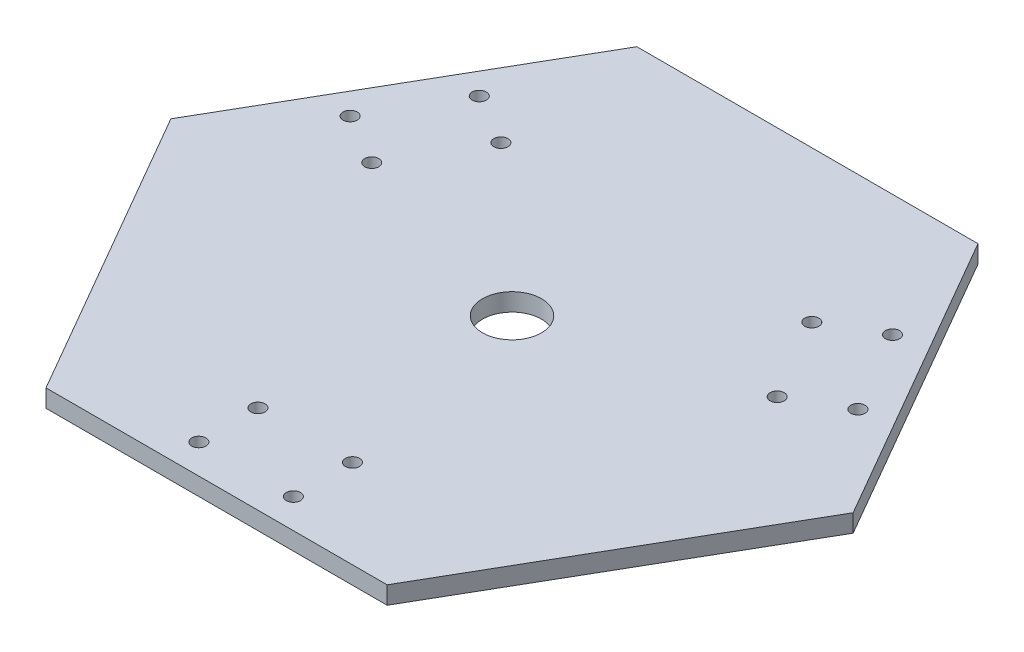
ISO-10303-21;
HEADER;
FILE_DESCRIPTION(('STEP AP214'),'2;1');
FILE_NAME('part.step','',(''),(''),'','','');
FILE_SCHEMA(('AUTOMOTIVE_DESIGN { 1 0 10303 214 1 1 1 1 }'));
ENDSEC;
DATA;
#1=APPLICATION_CONTEXT('core data for automotive mechanical design processes');
#2=APPLICATION_PROTOCOL_DEFINITION('international standard','automotive_design',2000,#1);
#3=PRODUCT_CONTEXT('',#1,'mechanical');
#4=PRODUCT('Part','Part','',(#3));
#5=PRODUCT_RELATED_PRODUCT_CATEGORY('part','',(#4));
#6=PRODUCT_DEFINITION_FORMATION('','',#4);
#7=PRODUCT_DEFINITION_CONTEXT('part definition',#1,'design');
#8=PRODUCT_DEFINITION('design','',#6,#7);
#9=PRODUCT_DEFINITION_SHAPE('','',#8);
#10=(LENGTH_UNIT() NAMED_UNIT(*) SI_UNIT(.MILLI.,.METRE.));
#11=(NAMED_UNIT(*) PLANE_ANGLE_UNIT() SI_UNIT($,.RADIAN.));
#12=(NAMED_UNIT(*) SI_UNIT($,.STERADIAN.) SOLID_ANGLE_UNIT());
#13=UNCERTAINTY_MEASURE_WITH_UNIT(LENGTH_MEASURE(1.E-05),#10,'distance_accuracy_value','');
#14=(GEOMETRIC_REPRESENTATION_CONTEXT(3) GLOBAL_UNCERTAINTY_ASSIGNED_CONTEXT((#13)) GLOBAL_UNIT_ASSIGNED_CONTEXT((#10,
#11,#12)) REPRESENTATION_CONTEXT('',''));
#15=CARTESIAN_POINT('',(0.,0.,0.));
#16=DIRECTION('',(0.,0.,1.));
#17=DIRECTION('',(1.,0.,0.));
#18=AXIS2_PLACEMENT_3D('',#15,#16,#17);
#19=CARTESIAN_POINT('',(57.7350269189626,3.,0.));
#20=DIRECTION('',(-0.866025403784438,0.,0.5));
#21=DIRECTION('',(0.5,0.,0.866025403784439));
#22=AXIS2_PLACEMENT_3D('',#19,#20,#21);
#23=PLANE('',#22);
#24=DIRECTION('',(-0.5,0.,-0.866025403784439));
#25=VECTOR('',#24,1.);
#26=CARTESIAN_POINT('',(57.7350269189626,0.,0.));
#27=LINE('',#26,#25);
#28=CARTESIAN_POINT('',(57.7350269189626,0.,0.));
#29=VERTEX_POINT('',#28);
#30=CARTESIAN_POINT('',(28.8675134594813,0.,-50.));
#31=VERTEX_POINT('',#30);
#32=EDGE_CURVE('E125',#29,#31,#27,.T.);
#33=ORIENTED_EDGE('',*,*,#32,.T.);
#34=DIRECTION('',(0.,-1.,0.));
#35=VECTOR('',#34,1.);
#36=CARTESIAN_POINT('',(28.8675134594813,3.,-50.));
#37=LINE('',#36,#35);
#38=CARTESIAN_POINT('',(28.8675134594813,3.,-50.));
#39=VERTEX_POINT('',#38);
#40=EDGE_CURVE('E11',#39,#31,#37,.T.);
#41=ORIENTED_EDGE('',*,*,#40,.F.);
#42=DIRECTION('',(-0.5,0.,-0.866025403784439));
#43=VECTOR('',#42,1.);
#44=CARTESIAN_POINT('',(57.7350269189626,3.,0.));
#45=LINE('',#44,#43);
#46=CARTESIAN_POINT('',(57.7350269189626,3.,0.));
#47=VERTEX_POINT('',#46);
#48=EDGE_CURVE('E136',#47,#39,#45,.T.);
#49=ORIENTED_EDGE('',*,*,#48,.F.);
#50=DIRECTION('',(0.,-1.,0.));
#51=VECTOR('',#50,1.);
#52=CARTESIAN_POINT('',(57.7350269189626,3.,0.));
#53=LINE('',#52,#51);
#54=EDGE_CURVE('E121',#47,#29,#53,.T.);
#55=ORIENTED_EDGE('',*,*,#54,.T.);
#56=EDGE_LOOP('',(#33,#41,#49,#55));
#57=FACE_BOUND('',#56,.T.);
#58=ADVANCED_FACE('F41',(#57),#23,.F.);
#59=CARTESIAN_POINT('',(28.8675134594813,3.,-50.));
#60=DIRECTION('',(0.,0.,1.));
#61=DIRECTION('',(1.,0.,0.));
#62=AXIS2_PLACEMENT_3D('',#59,#60,#61);
#63=PLANE('',#62);
#64=DIRECTION('',(-1.,0.,0.));
#65=VECTOR('',#64,1.);
#66=CARTESIAN_POINT('',(28.8675134594813,0.,-50.));
#67=LINE('',#66,#65);
#68=CARTESIAN_POINT('',(-28.8675134594813,0.,-50.));
#69=VERTEX_POINT('',#68);
#70=EDGE_CURVE('E128',#31,#69,#67,.T.);
#71=ORIENTED_EDGE('',*,*,#70,.T.);
#72=DIRECTION('',(0.,-1.,0.));
#73=VECTOR('',#72,1.);
#74=CARTESIAN_POINT('',(-28.8675134594813,3.,-50.));
#75=LINE('',#74,#73);
#76=CARTESIAN_POINT('',(-28.8675134594813,3.,-50.));
#77=VERTEX_POINT('',#76);
#78=EDGE_CURVE('E49',#77,#69,#75,.T.);
#79=ORIENTED_EDGE('',*,*,#78,.F.);
#80=DIRECTION('',(-1.,0.,0.));
#81=VECTOR('',#80,1.);
#82=CARTESIAN_POINT('',(28.8675134594813,3.,-50.));
#83=LINE('',#82,#81);
#84=EDGE_CURVE('E94',#39,#77,#83,.T.);
#85=ORIENTED_EDGE('',*,*,#84,.F.);
#86=ORIENTED_EDGE('',*,*,#40,.T.);
#87=EDGE_LOOP('',(#71,#79,#85,#86));
#88=FACE_BOUND('',#87,.T.);
#89=ADVANCED_FACE('F161',(#88),#63,.F.);
#90=CARTESIAN_POINT('',(-28.8675134594813,3.,-50.));
#91=DIRECTION('',(0.866025403784439,0.,0.499999999999999));
#92=DIRECTION('',(0.499999999999999,0.,-0.866025403784439));
#93=AXIS2_PLACEMENT_3D('',#90,#91,#92);
#94=PLANE('',#93);
#95=DIRECTION('',(-0.499999999999999,0.,0.866025403784439));
#96=VECTOR('',#95,1.);
#97=CARTESIAN_POINT('',(-28.8675134594813,0.,-50.));
#98=LINE('',#97,#96);
#99=CARTESIAN_POINT('',(-57.7350269189626,0.,0.));
#100=VERTEX_POINT('',#99);
#101=EDGE_CURVE('E131',#69,#100,#98,.T.);
#102=ORIENTED_EDGE('',*,*,#101,.T.);
#103=DIRECTION('',(0.,-1.,0.));
#104=VECTOR('',#103,1.);
#105=CARTESIAN_POINT('',(-57.7350269189626,3.,0.));
#106=LINE('',#105,#104);
#107=CARTESIAN_POINT('',(-57.7350269189626,3.,0.));
#108=VERTEX_POINT('',#107);
#109=EDGE_CURVE('E116',#108,#100,#106,.T.);
#110=ORIENTED_EDGE('',*,*,#109,.F.);
#111=DIRECTION('',(-0.499999999999999,0.,0.866025403784439));
#112=VECTOR('',#111,1.);
#113=CARTESIAN_POINT('',(-28.8675134594813,3.,-50.));
#114=LINE('',#113,#112);
#115=EDGE_CURVE('E107',#77,#108,#114,.T.);
#116=ORIENTED_EDGE('',*,*,#115,.F.);
#117=ORIENTED_EDGE('',*,*,#78,.T.);
#118=EDGE_LOOP('',(#102,#110,#116,#117));
#119=FACE_BOUND('',#118,.T.);
#120=ADVANCED_FACE('F142',(#119),#94,.F.);
#121=CARTESIAN_POINT('',(-57.7350269189626,3.,0.));
#122=DIRECTION('',(0.866025403784438,0.,-0.5));
#123=DIRECTION('',(-0.5,0.,-0.866025403784439));
#124=AXIS2_PLACEMENT_3D('',#121,#122,#123);
#125=PLANE('',#124);
#126=DIRECTION('',(0.5,0.,0.866025403784438));
#127=VECTOR('',#126,1.);
#128=CARTESIAN_POINT('',(-57.7350269189626,0.,0.));
#129=LINE('',#128,#127);
#130=CARTESIAN_POINT('',(-28.8675134594813,0.,50.));
#131=VERTEX_POINT('',#130);
#132=EDGE_CURVE('E115',#100,#131,#129,.T.);
#133=ORIENTED_EDGE('',*,*,#132,.T.);
#134=DIRECTION('',(0.,-1.,0.));
#135=VECTOR('',#134,1.);
#136=CARTESIAN_POINT('',(-28.8675134594813,3.,50.));
#137=LINE('',#136,#135);
#138=CARTESIAN_POINT('',(-28.8675134594813,3.,50.));
#139=VERTEX_POINT('',#138);
#140=EDGE_CURVE('E112',#139,#131,#137,.T.);
#141=ORIENTED_EDGE('',*,*,#140,.F.);
#142=DIRECTION('',(0.5,0.,0.866025403784438));
#143=VECTOR('',#142,1.);
#144=CARTESIAN_POINT('',(-57.7350269189626,3.,0.));
#145=LINE('',#144,#143);
#146=EDGE_CURVE('E101',#108,#139,#145,.T.);
#147=ORIENTED_EDGE('',*,*,#146,.F.);
#148=ORIENTED_EDGE('',*,*,#109,.T.);
#149=EDGE_LOOP('',(#133,#141,#147,#148));
#150=FACE_BOUND('',#149,.T.);
#151=ADVANCED_FACE('F113',(#150),#125,.F.);
#152=CARTESIAN_POINT('',(-28.8675134594813,3.,50.));
#153=DIRECTION('',(0.,0.,-1.));
#154=DIRECTION('',(-1.,0.,0.));
#155=AXIS2_PLACEMENT_3D('',#152,#153,#154);
#156=PLANE('',#155);
#157=DIRECTION('',(1.,0.,0.));
#158=VECTOR('',#157,1.);
#159=CARTESIAN_POINT('',(-28.8675134594813,0.,50.));
#160=LINE('',#159,#158);
#161=CARTESIAN_POINT('',(28.8675134594813,0.,50.));
#162=VERTEX_POINT('',#161);
#163=EDGE_CURVE('E80',#131,#162,#160,.T.);
#164=ORIENTED_EDGE('',*,*,#163,.T.);
#165=DIRECTION('',(0.,-1.,0.));
#166=VECTOR('',#165,1.);
#167=CARTESIAN_POINT('',(28.8675134594813,3.,50.));
#168=LINE('',#167,#166);
#169=CARTESIAN_POINT('',(28.8675134594813,3.,50.));
#170=VERTEX_POINT('',#169);
#171=EDGE_CURVE('E117',#170,#162,#168,.T.);
#172=ORIENTED_EDGE('',*,*,#171,.F.);
#173=DIRECTION('',(1.,0.,0.));
#174=VECTOR('',#173,1.);
#175=CARTESIAN_POINT('',(-28.8675134594813,3.,50.));
#176=LINE('',#175,#174);
#177=EDGE_CURVE('E105',#139,#170,#176,.T.);
#178=ORIENTED_EDGE('',*,*,#177,.F.);
#179=ORIENTED_EDGE('',*,*,#140,.T.);
#180=EDGE_LOOP('',(#164,#172,#178,#179));
#181=FACE_BOUND('',#180,.T.);
#182=ADVANCED_FACE('F119',(#181),#156,.F.);
#183=CARTESIAN_POINT('',(28.8675134594813,3.,50.));
#184=DIRECTION('',(-0.866025403784439,0.,-0.5));
#185=DIRECTION('',(-0.5,0.,0.866025403784439));
#186=AXIS2_PLACEMENT_3D('',#183,#184,#185);
#187=PLANE('',#186);
#188=DIRECTION('',(0.5,0.,-0.866025403784439));
#189=VECTOR('',#188,1.);
#190=CARTESIAN_POINT('',(28.8675134594813,0.,50.));
#191=LINE('',#190,#189);
#192=EDGE_CURVE('E86',#162,#29,#191,.T.);
#193=ORIENTED_EDGE('',*,*,#192,.T.);
#194=ORIENTED_EDGE('',*,*,#54,.F.);
#195=DIRECTION('',(0.5,0.,-0.866025403784439));
#196=VECTOR('',#195,1.);
#197=CARTESIAN_POINT('',(28.8675134594813,3.,50.));
#198=LINE('',#197,#196);
#199=EDGE_CURVE('E57',#170,#47,#198,.T.);
#200=ORIENTED_EDGE('',*,*,#199,.F.);
#201=ORIENTED_EDGE('',*,*,#171,.T.);
#202=EDGE_LOOP('',(#193,#194,#200,#201));
#203=FACE_BOUND('',#202,.T.);
#204=ADVANCED_FACE('F149',(#203),#187,.F.);
#205=CARTESIAN_POINT('',(0.,3.,0.));
#206=DIRECTION('',(0.,1.,0.));
#207=DIRECTION('',(0.,0.,1.));
#208=AXIS2_PLACEMENT_3D('',#205,#206,#207);
#209=PLANE('',#208);
#210=CARTESIAN_POINT('',(-42.9711431702997,3.,-15.5717967697247));
#211=DIRECTION('',(0.,-1.,0.));
#212=DIRECTION('',(0.866025403784436,0.,0.500000000000004));
#213=AXIS2_PLACEMENT_3D('',#210,#211,#212);
#214=CIRCLE('',#213,1.2);
#215=CARTESIAN_POINT('',(-41.9319126857584,3.,-14.9717967697247));
#216=VERTEX_POINT('',#215);
#217=EDGE_CURVE('E398',#216,#216,#214,.T.);
#218=ORIENTED_EDGE('',*,*,#217,.T.);
#219=EDGE_LOOP('',(#218));
#220=FACE_BOUND('',#219,.T.);
#221=CARTESIAN_POINT('',(-34.3108891324553,3.,-10.5717967697247));
#222=DIRECTION('',(0.,-1.,0.));
#223=DIRECTION('',(0.866025403784436,0.,0.500000000000004));
#224=AXIS2_PLACEMENT_3D('',#221,#222,#223);
#225=CIRCLE('',#224,1.2);
#226=CARTESIAN_POINT('',(-33.271658647914,3.,-9.97179676972466));
#227=VERTEX_POINT('',#226);
#228=EDGE_CURVE('E402',#227,#227,#225,.T.);
#229=ORIENTED_EDGE('',*,*,#228,.T.);
#230=EDGE_LOOP('',(#229));
#231=FACE_BOUND('',#230,.T.);
#232=CARTESIAN_POINT('',(-26.3108891324553,3.,-24.4282032302757));
#233=DIRECTION('',(0.,-1.,0.));
#234=DIRECTION('',(0.866025403784436,0.,0.500000000000004));
#235=AXIS2_PLACEMENT_3D('',#232,#233,#234);
#236=CIRCLE('',#235,1.2);
#237=CARTESIAN_POINT('',(-25.2716586479139,3.,-23.8282032302756));
#238=VERTEX_POINT('',#237);
#239=EDGE_CURVE('E413',#238,#238,#236,.T.);
#240=ORIENTED_EDGE('',*,*,#239,.T.);
#241=EDGE_LOOP('',(#240));
#242=FACE_BOUND('',#241,.T.);
#243=CARTESIAN_POINT('',(42.9711431702999,3.,-15.5717967697241));
#244=DIRECTION('',(0.,-1.,0.));
#245=DIRECTION('',(-0.866025403784443,0.,0.499999999999992));
#246=AXIS2_PLACEMENT_3D('',#243,#244,#245);
#247=CIRCLE('',#246,1.2);
#248=CARTESIAN_POINT('',(41.9319126857586,3.,-14.9717967697241));
#249=VERTEX_POINT('',#248);
#250=EDGE_CURVE('E419',#249,#249,#247,.T.);
#251=ORIENTED_EDGE('',*,*,#250,.T.);
#252=EDGE_LOOP('',(#251));
#253=FACE_BOUND('',#252,.T.);
#254=CARTESIAN_POINT('',(34.9711431703,3.,-29.4282032302752));
#255=DIRECTION('',(0.,-1.,0.));
#256=DIRECTION('',(-0.866025403784443,0.,0.499999999999992));
#257=AXIS2_PLACEMENT_3D('',#254,#255,#256);
#258=CIRCLE('',#257,1.2);
#259=CARTESIAN_POINT('',(33.9319126857587,3.,-28.8282032302752));
#260=VERTEX_POINT('',#259);
#261=EDGE_CURVE('E425',#260,#260,#258,.T.);
#262=ORIENTED_EDGE('',*,*,#261,.T.);
#263=EDGE_LOOP('',(#262));
#264=FACE_BOUND('',#263,.T.);
#265=CARTESIAN_POINT('',(26.3108891324556,3.,-24.4282032302753));
#266=DIRECTION('',(0.,-1.,0.));
#267=DIRECTION('',(-0.866025403784443,0.,0.499999999999992));
#268=AXIS2_PLACEMENT_3D('',#265,#266,#267);
#269=CIRCLE('',#268,1.2);
#270=CARTESIAN_POINT('',(25.2716586479143,3.,-23.8282032302753));
#271=VERTEX_POINT('',#270);
#272=EDGE_CURVE('E499',#271,#271,#269,.T.);
#273=ORIENTED_EDGE('',*,*,#272,.T.);
#274=EDGE_LOOP('',(#273));
#275=FACE_BOUND('',#274,.T.);
#276=CARTESIAN_POINT('',(34.3108891324555,3.,-10.5717967697242));
#277=DIRECTION('',(0.,-1.,0.));
#278=DIRECTION('',(-0.866025403784443,0.,0.499999999999992));
#279=AXIS2_PLACEMENT_3D('',#276,#277,#278);
#280=CIRCLE('',#279,1.2);
#281=CARTESIAN_POINT('',(33.2716586479141,3.,-9.97179676972419));
#282=VERTEX_POINT('',#281);
#283=EDGE_CURVE('E507',#282,#282,#280,.T.);
#284=ORIENTED_EDGE('',*,*,#283,.T.);
#285=EDGE_LOOP('',(#284));
#286=FACE_BOUND('',#285,.T.);
#287=CARTESIAN_POINT('',(-34.9711431702996,3.,-29.4282032302757));
#288=DIRECTION('',(0.,-1.,0.));
#289=DIRECTION('',(0.866025403784436,0.,0.500000000000004));
#290=AXIS2_PLACEMENT_3D('',#287,#288,#289);
#291=CIRCLE('',#290,1.2);
#292=CARTESIAN_POINT('',(-33.9319126857583,3.,-28.8282032302757));
#293=VERTEX_POINT('',#292);
#294=EDGE_CURVE('E426',#293,#293,#291,.T.);
#295=ORIENTED_EDGE('',*,*,#294,.T.);
#296=EDGE_LOOP('',(#295));
#297=FACE_BOUND('',#296,.T.);
#298=CARTESIAN_POINT('',(-8.,3.,35.));
#299=DIRECTION('',(0.,-1.,0.));
#300=DIRECTION('',(0.,0.,-1.));
#301=AXIS2_PLACEMENT_3D('',#298,#299,#300);
#302=CIRCLE('',#301,1.2);
#303=CARTESIAN_POINT('',(-8.,3.,33.8));
#304=VERTEX_POINT('',#303);
#305=EDGE_CURVE('E429',#304,#304,#302,.T.);
#306=ORIENTED_EDGE('',*,*,#305,.T.);
#307=EDGE_LOOP('',(#306));
#308=FACE_BOUND('',#307,.T.);
#309=CARTESIAN_POINT('',(8.,3.,35.));
#310=DIRECTION('',(0.,-1.,0.));
#311=DIRECTION('',(0.,0.,-1.));
#312=AXIS2_PLACEMENT_3D('',#309,#310,#311);
#313=CIRCLE('',#312,1.2);
#314=CARTESIAN_POINT('',(8.,3.,33.8));
#315=VERTEX_POINT('',#314);
#316=EDGE_CURVE('E442',#315,#315,#313,.T.);
#317=ORIENTED_EDGE('',*,*,#316,.T.);
#318=EDGE_LOOP('',(#317));
#319=FACE_BOUND('',#318,.T.);
#320=CARTESIAN_POINT('',(8.,3.,45.));
#321=DIRECTION('',(0.,-1.,0.));
#322=DIRECTION('',(0.,0.,-1.));
#323=AXIS2_PLACEMENT_3D('',#320,#321,#322);
#324=CIRCLE('',#323,1.2);
#325=CARTESIAN_POINT('',(8.,3.,43.8));
#326=VERTEX_POINT('',#325);
#327=EDGE_CURVE('E436',#326,#326,#324,.T.);
#328=ORIENTED_EDGE('',*,*,#327,.T.);
#329=EDGE_LOOP('',(#328));
#330=FACE_BOUND('',#329,.T.);
#331=CARTESIAN_POINT('',(-8.,3.,45.));
#332=DIRECTION('',(0.,-1.,0.));
#333=DIRECTION('',(0.,0.,-1.));
#334=AXIS2_PLACEMENT_3D('',#331,#332,#333);
#335=CIRCLE('',#334,1.2);
#336=CARTESIAN_POINT('',(-8.,3.,43.8));
#337=VERTEX_POINT('',#336);
#338=EDGE_CURVE('E450',#337,#337,#335,.T.);
#339=ORIENTED_EDGE('',*,*,#338,.T.);
#340=EDGE_LOOP('',(#339));
#341=FACE_BOUND('',#340,.T.);
#342=CARTESIAN_POINT('',(0.,3.,0.));
#343=DIRECTION('',(0.,1.,0.));
#344=DIRECTION('',(0.,0.,1.));
#345=AXIS2_PLACEMENT_3D('',#342,#343,#344);
#346=CIRCLE('',#345,5.);
#347=CARTESIAN_POINT('',(0.,3.,5.));
#348=VERTEX_POINT('',#347);
#349=EDGE_CURVE('E453',#348,#348,#346,.T.);
#350=ORIENTED_EDGE('',*,*,#349,.F.);
#351=EDGE_LOOP('',(#350));
#352=FACE_BOUND('',#351,.T.);
#353=ORIENTED_EDGE('',*,*,#48,.T.);
#354=ORIENTED_EDGE('',*,*,#84,.T.);
#355=ORIENTED_EDGE('',*,*,#115,.T.);
#356=ORIENTED_EDGE('',*,*,#146,.T.);
#357=ORIENTED_EDGE('',*,*,#177,.T.);
#358=ORIENTED_EDGE('',*,*,#199,.T.);
#359=EDGE_LOOP('',(#353,#354,#355,#356,#357,#358));
#360=FACE_BOUND('',#359,.T.);
#361=ADVANCED_FACE('F103',(#220,#231,#242,#253,#264,#275,#286,#297,#308,#319,#330,#341,#352,
#360),#209,.T.);
#362=CARTESIAN_POINT('',(0.,0.,0.));
#363=DIRECTION('',(0.,1.,0.));
#364=DIRECTION('',(0.,0.,1.));
#365=AXIS2_PLACEMENT_3D('',#362,#363,#364);
#366=PLANE('',#365);
#367=CARTESIAN_POINT('',(-42.9711431702997,0.,-15.5717967697247));
#368=DIRECTION('',(0.,-1.,0.));
#369=DIRECTION('',(0.866025403784436,0.,0.500000000000004));
#370=AXIS2_PLACEMENT_3D('',#367,#368,#369);
#371=CIRCLE('',#370,1.2);
#372=CARTESIAN_POINT('',(-41.9319126857584,0.,-14.9717967697247));
#373=VERTEX_POINT('',#372);
#374=EDGE_CURVE('E401',#373,#373,#371,.T.);
#375=ORIENTED_EDGE('',*,*,#374,.F.);
#376=EDGE_LOOP('',(#375));
#377=FACE_BOUND('',#376,.T.);
#378=CARTESIAN_POINT('',(-34.3108891324553,0.,-10.5717967697247));
#379=DIRECTION('',(0.,-1.,0.));
#380=DIRECTION('',(0.866025403784436,0.,0.500000000000004));
#381=AXIS2_PLACEMENT_3D('',#378,#379,#380);
#382=CIRCLE('',#381,1.2);
#383=CARTESIAN_POINT('',(-33.271658647914,0.,-9.97179676972466));
#384=VERTEX_POINT('',#383);
#385=EDGE_CURVE('E407',#384,#384,#382,.T.);
#386=ORIENTED_EDGE('',*,*,#385,.F.);
#387=EDGE_LOOP('',(#386));
#388=FACE_BOUND('',#387,.T.);
#389=CARTESIAN_POINT('',(-26.3108891324553,0.,-24.4282032302757));
#390=DIRECTION('',(0.,-1.,0.));
#391=DIRECTION('',(0.866025403784436,0.,0.500000000000004));
#392=AXIS2_PLACEMENT_3D('',#389,#390,#391);
#393=CIRCLE('',#392,1.2);
#394=CARTESIAN_POINT('',(-25.2716586479139,0.,-23.8282032302756));
#395=VERTEX_POINT('',#394);
#396=EDGE_CURVE('E416',#395,#395,#393,.T.);
#397=ORIENTED_EDGE('',*,*,#396,.F.);
#398=EDGE_LOOP('',(#397));
#399=FACE_BOUND('',#398,.T.);
#400=CARTESIAN_POINT('',(42.9711431702999,0.,-15.5717967697241));
#401=DIRECTION('',(0.,-1.,0.));
#402=DIRECTION('',(-0.866025403784443,0.,0.499999999999992));
#403=AXIS2_PLACEMENT_3D('',#400,#401,#402);
#404=CIRCLE('',#403,1.2);
#405=CARTESIAN_POINT('',(41.9319126857586,0.,-14.9717967697241));
#406=VERTEX_POINT('',#405);
#407=EDGE_CURVE('E422',#406,#406,#404,.T.);
#408=ORIENTED_EDGE('',*,*,#407,.F.);
#409=EDGE_LOOP('',(#408));
#410=FACE_BOUND('',#409,.T.);
#411=CARTESIAN_POINT('',(34.9711431703,0.,-29.4282032302752));
#412=DIRECTION('',(0.,-1.,0.));
#413=DIRECTION('',(-0.866025403784443,0.,0.499999999999992));
#414=AXIS2_PLACEMENT_3D('',#411,#412,#413);
#415=CIRCLE('',#414,1.2);
#416=CARTESIAN_POINT('',(33.9319126857587,0.,-28.8282032302752));
#417=VERTEX_POINT('',#416);
#418=EDGE_CURVE('E494',#417,#417,#415,.T.);
#419=ORIENTED_EDGE('',*,*,#418,.F.);
#420=EDGE_LOOP('',(#419));
#421=FACE_BOUND('',#420,.T.);
#422=CARTESIAN_POINT('',(26.3108891324556,0.,-24.4282032302753));
#423=DIRECTION('',(0.,-1.,0.));
#424=DIRECTION('',(-0.866025403784443,0.,0.499999999999992));
#425=AXIS2_PLACEMENT_3D('',#422,#423,#424);
#426=CIRCLE('',#425,1.2);
#427=CARTESIAN_POINT('',(25.2716586479143,0.,-23.8282032302753));
#428=VERTEX_POINT('',#427);
#429=EDGE_CURVE('E504',#428,#428,#426,.T.);
#430=ORIENTED_EDGE('',*,*,#429,.F.);
#431=EDGE_LOOP('',(#430));
#432=FACE_BOUND('',#431,.T.);
#433=CARTESIAN_POINT('',(34.3108891324555,0.,-10.5717967697242));
#434=DIRECTION('',(0.,-1.,0.));
#435=DIRECTION('',(-0.866025403784443,0.,0.499999999999992));
#436=AXIS2_PLACEMENT_3D('',#433,#434,#435);
#437=CIRCLE('',#436,1.2);
#438=CARTESIAN_POINT('',(33.2716586479141,0.,-9.97179676972419));
#439=VERTEX_POINT('',#438);
#440=EDGE_CURVE('E509',#439,#439,#437,.T.);
#441=ORIENTED_EDGE('',*,*,#440,.F.);
#442=EDGE_LOOP('',(#441));
#443=FACE_BOUND('',#442,.T.);
#444=CARTESIAN_POINT('',(-34.9711431702996,0.,-29.4282032302757));
#445=DIRECTION('',(0.,-1.,0.));
#446=DIRECTION('',(0.866025403784436,0.,0.500000000000004));
#447=AXIS2_PLACEMENT_3D('',#444,#445,#446);
#448=CIRCLE('',#447,1.2);
#449=CARTESIAN_POINT('',(-33.9319126857583,0.,-28.8282032302757));
#450=VERTEX_POINT('',#449);
#451=EDGE_CURVE('E404',#450,#450,#448,.T.);
#452=ORIENTED_EDGE('',*,*,#451,.F.);
#453=EDGE_LOOP('',(#452));
#454=FACE_BOUND('',#453,.T.);
#455=CARTESIAN_POINT('',(-8.,0.,35.));
#456=DIRECTION('',(0.,-1.,0.));
#457=DIRECTION('',(0.,0.,-1.));
#458=AXIS2_PLACEMENT_3D('',#455,#456,#457);
#459=CIRCLE('',#458,1.2);
#460=CARTESIAN_POINT('',(-8.,0.,33.8));
#461=VERTEX_POINT('',#460);
#462=EDGE_CURVE('E445',#461,#461,#459,.T.);
#463=ORIENTED_EDGE('',*,*,#462,.F.);
#464=EDGE_LOOP('',(#463));
#465=FACE_BOUND('',#464,.T.);
#466=CARTESIAN_POINT('',(8.,0.,35.));
#467=DIRECTION('',(0.,-1.,0.));
#468=DIRECTION('',(0.,0.,-1.));
#469=AXIS2_PLACEMENT_3D('',#466,#467,#468);
#470=CIRCLE('',#469,1.2);
#471=CARTESIAN_POINT('',(8.,0.,33.8));
#472=VERTEX_POINT('',#471);
#473=EDGE_CURVE('E439',#472,#472,#470,.T.);
#474=ORIENTED_EDGE('',*,*,#473,.F.);
#475=EDGE_LOOP('',(#474));
#476=FACE_BOUND('',#475,.T.);
#477=CARTESIAN_POINT('',(8.,0.,45.));
#478=DIRECTION('',(0.,-1.,0.));
#479=DIRECTION('',(0.,0.,-1.));
#480=AXIS2_PLACEMENT_3D('',#477,#478,#479);
#481=CIRCLE('',#480,1.2);
#482=CARTESIAN_POINT('',(8.,0.,43.8));
#483=VERTEX_POINT('',#482);
#484=EDGE_CURVE('E432',#483,#483,#481,.T.);
#485=ORIENTED_EDGE('',*,*,#484,.F.);
#486=EDGE_LOOP('',(#485));
#487=FACE_BOUND('',#486,.T.);
#488=CARTESIAN_POINT('',(-8.,0.,45.));
#489=DIRECTION('',(0.,-1.,0.));
#490=DIRECTION('',(0.,0.,-1.));
#491=AXIS2_PLACEMENT_3D('',#488,#489,#490);
#492=CIRCLE('',#491,1.2);
#493=CARTESIAN_POINT('',(-8.,0.,43.8));
#494=VERTEX_POINT('',#493);
#495=EDGE_CURVE('E435',#494,#494,#492,.T.);
#496=ORIENTED_EDGE('',*,*,#495,.F.);
#497=EDGE_LOOP('',(#496));
#498=FACE_BOUND('',#497,.T.);
#499=CARTESIAN_POINT('',(0.,0.,0.));
#500=DIRECTION('',(0.,1.,0.));
#501=DIRECTION('',(0.,0.,1.));
#502=AXIS2_PLACEMENT_3D('',#499,#500,#501);
#503=CIRCLE('',#502,5.);
#504=CARTESIAN_POINT('',(0.,0.,5.));
#505=VERTEX_POINT('',#504);
#506=EDGE_CURVE('E129',#505,#505,#503,.T.);
#507=ORIENTED_EDGE('',*,*,#506,.T.);
#508=EDGE_LOOP('',(#507));
#509=FACE_BOUND('',#508,.T.);
#510=ORIENTED_EDGE('',*,*,#32,.F.);
#511=ORIENTED_EDGE('',*,*,#192,.F.);
#512=ORIENTED_EDGE('',*,*,#163,.F.);
#513=ORIENTED_EDGE('',*,*,#132,.F.);
#514=ORIENTED_EDGE('',*,*,#101,.F.);
#515=ORIENTED_EDGE('',*,*,#70,.F.);
#516=EDGE_LOOP('',(#510,#511,#512,#513,#514,#515));
#517=FACE_BOUND('',#516,.T.);
#518=ADVANCED_FACE('F145',(#377,#388,#399,#410,#421,#432,#443,#454,#465,#476,#487,#498,#509,
#517),#366,.F.);
#519=CARTESIAN_POINT('',(0.,0.,0.));
#520=DIRECTION('',(0.,1.,0.));
#521=DIRECTION('',(0.,0.,1.));
#522=AXIS2_PLACEMENT_3D('',#519,#520,#521);
#523=CYLINDRICAL_SURFACE('',#522,5.);
#524=ORIENTED_EDGE('',*,*,#506,.F.);
#525=EDGE_LOOP('',(#524));
#526=FACE_BOUND('',#525,.T.);
#527=ORIENTED_EDGE('',*,*,#349,.T.);
#528=EDGE_LOOP('',(#527));
#529=FACE_BOUND('',#528,.T.);
#530=ADVANCED_FACE('F194',(#526,#529),#523,.F.);
#531=CARTESIAN_POINT('',(-8.,3.,45.));
#532=DIRECTION('',(0.,-1.,0.));
#533=DIRECTION('',(0.,0.,-1.));
#534=AXIS2_PLACEMENT_3D('',#531,#532,#533);
#535=CYLINDRICAL_SURFACE('',#534,1.2);
#536=ORIENTED_EDGE('',*,*,#338,.F.);
#537=EDGE_LOOP('',(#536));
#538=FACE_BOUND('',#537,.T.);
#539=ORIENTED_EDGE('',*,*,#495,.T.);
#540=EDGE_LOOP('',(#539));
#541=FACE_BOUND('',#540,.T.);
#542=ADVANCED_FACE('F203',(#538,#541),#535,.F.);
#543=CARTESIAN_POINT('',(8.,3.,45.));
#544=DIRECTION('',(0.,-1.,0.));
#545=DIRECTION('',(0.,0.,-1.));
#546=AXIS2_PLACEMENT_3D('',#543,#544,#545);
#547=CYLINDRICAL_SURFACE('',#546,1.2);
#548=ORIENTED_EDGE('',*,*,#327,.F.);
#549=EDGE_LOOP('',(#548));
#550=FACE_BOUND('',#549,.T.);
#551=ORIENTED_EDGE('',*,*,#484,.T.);
#552=EDGE_LOOP('',(#551));
#553=FACE_BOUND('',#552,.T.);
#554=ADVANCED_FACE('F211',(#550,#553),#547,.F.);
#555=CARTESIAN_POINT('',(8.,3.,35.));
#556=DIRECTION('',(0.,-1.,0.));
#557=DIRECTION('',(0.,0.,-1.));
#558=AXIS2_PLACEMENT_3D('',#555,#556,#557);
#559=CYLINDRICAL_SURFACE('',#558,1.2);
#560=ORIENTED_EDGE('',*,*,#316,.F.);
#561=EDGE_LOOP('',(#560));
#562=FACE_BOUND('',#561,.T.);
#563=ORIENTED_EDGE('',*,*,#473,.T.);
#564=EDGE_LOOP('',(#563));
#565=FACE_BOUND('',#564,.T.);
#566=ADVANCED_FACE('F219',(#562,#565),#559,.F.);
#567=CARTESIAN_POINT('',(-8.,3.,35.));
#568=DIRECTION('',(0.,-1.,0.));
#569=DIRECTION('',(0.,0.,-1.));
#570=AXIS2_PLACEMENT_3D('',#567,#568,#569);
#571=CYLINDRICAL_SURFACE('',#570,1.2);
#572=ORIENTED_EDGE('',*,*,#305,.F.);
#573=EDGE_LOOP('',(#572));
#574=FACE_BOUND('',#573,.T.);
#575=ORIENTED_EDGE('',*,*,#462,.T.);
#576=EDGE_LOOP('',(#575));
#577=FACE_BOUND('',#576,.T.);
#578=ADVANCED_FACE('F227',(#574,#577),#571,.F.);
#579=CARTESIAN_POINT('',(-34.9711431702996,3.,-29.4282032302757));
#580=DIRECTION('',(0.,-1.,0.));
#581=DIRECTION('',(0.,0.,-1.));
#582=AXIS2_PLACEMENT_3D('',#579,#580,#581);
#583=CYLINDRICAL_SURFACE('',#582,1.2);
#584=ORIENTED_EDGE('',*,*,#294,.F.);
#585=EDGE_LOOP('',(#584));
#586=FACE_BOUND('',#585,.T.);
#587=ORIENTED_EDGE('',*,*,#451,.T.);
#588=EDGE_LOOP('',(#587));
#589=FACE_BOUND('',#588,.T.);
#590=ADVANCED_FACE('F234',(#586,#589),#583,.F.);
#591=CARTESIAN_POINT('',(34.3108891324555,3.,-10.5717967697242));
#592=DIRECTION('',(0.,-1.,0.));
#593=DIRECTION('',(0.,0.,-1.));
#594=AXIS2_PLACEMENT_3D('',#591,#592,#593);
#595=CYLINDRICAL_SURFACE('',#594,1.2);
#596=ORIENTED_EDGE('',*,*,#283,.F.);
#597=EDGE_LOOP('',(#596));
#598=FACE_BOUND('',#597,.T.);
#599=ORIENTED_EDGE('',*,*,#440,.T.);
#600=EDGE_LOOP('',(#599));
#601=FACE_BOUND('',#600,.T.);
#602=ADVANCED_FACE('F241',(#598,#601),#595,.F.);
#603=CARTESIAN_POINT('',(26.3108891324556,3.,-24.4282032302753));
#604=DIRECTION('',(0.,-1.,0.));
#605=DIRECTION('',(0.,0.,-1.));
#606=AXIS2_PLACEMENT_3D('',#603,#604,#605);
#607=CYLINDRICAL_SURFACE('',#606,1.2);
#608=ORIENTED_EDGE('',*,*,#272,.F.);
#609=EDGE_LOOP('',(#608));
#610=FACE_BOUND('',#609,.T.);
#611=ORIENTED_EDGE('',*,*,#429,.T.);
#612=EDGE_LOOP('',(#611));
#613=FACE_BOUND('',#612,.T.);
#614=ADVANCED_FACE('F249',(#610,#613),#607,.F.);
#615=CARTESIAN_POINT('',(34.9711431703,3.,-29.4282032302752));
#616=DIRECTION('',(0.,-1.,0.));
#617=DIRECTION('',(0.,0.,-1.));
#618=AXIS2_PLACEMENT_3D('',#615,#616,#617);
#619=CYLINDRICAL_SURFACE('',#618,1.2);
#620=ORIENTED_EDGE('',*,*,#261,.F.);
#621=EDGE_LOOP('',(#620));
#622=FACE_BOUND('',#621,.T.);
#623=ORIENTED_EDGE('',*,*,#418,.T.);
#624=EDGE_LOOP('',(#623));
#625=FACE_BOUND('',#624,.T.);
#626=ADVANCED_FACE('F257',(#622,#625),#619,.F.);
#627=CARTESIAN_POINT('',(42.9711431702999,3.,-15.5717967697241));
#628=DIRECTION('',(0.,-1.,0.));
#629=DIRECTION('',(0.,0.,-1.));
#630=AXIS2_PLACEMENT_3D('',#627,#628,#629);
#631=CYLINDRICAL_SURFACE('',#630,1.2);
#632=ORIENTED_EDGE('',*,*,#250,.F.);
#633=EDGE_LOOP('',(#632));
#634=FACE_BOUND('',#633,.T.);
#635=ORIENTED_EDGE('',*,*,#407,.T.);
#636=EDGE_LOOP('',(#635));
#637=FACE_BOUND('',#636,.T.);
#638=ADVANCED_FACE('F265',(#634,#637),#631,.F.);
#639=CARTESIAN_POINT('',(-26.3108891324553,3.,-24.4282032302757));
#640=DIRECTION('',(0.,-1.,0.));
#641=DIRECTION('',(0.,0.,-1.));
#642=AXIS2_PLACEMENT_3D('',#639,#640,#641);
#643=CYLINDRICAL_SURFACE('',#642,1.2);
#644=ORIENTED_EDGE('',*,*,#239,.F.);
#645=EDGE_LOOP('',(#644));
#646=FACE_BOUND('',#645,.T.);
#647=ORIENTED_EDGE('',*,*,#396,.T.);
#648=EDGE_LOOP('',(#647));
#649=FACE_BOUND('',#648,.T.);
#650=ADVANCED_FACE('F273',(#646,#649),#643,.F.);
#651=CARTESIAN_POINT('',(-34.3108891324553,3.,-10.5717967697247));
#652=DIRECTION('',(0.,-1.,0.));
#653=DIRECTION('',(0.,0.,-1.));
#654=AXIS2_PLACEMENT_3D('',#651,#652,#653);
#655=CYLINDRICAL_SURFACE('',#654,1.2);
#656=ORIENTED_EDGE('',*,*,#228,.F.);
#657=EDGE_LOOP('',(#656));
#658=FACE_BOUND('',#657,.T.);
#659=ORIENTED_EDGE('',*,*,#385,.T.);
#660=EDGE_LOOP('',(#659));
#661=FACE_BOUND('',#660,.T.);
#662=ADVANCED_FACE('F281',(#658,#661),#655,.F.);
#663=CARTESIAN_POINT('',(-42.9711431702997,3.,-15.5717967697247));
#664=DIRECTION('',(0.,-1.,0.));
#665=DIRECTION('',(0.,0.,-1.));
#666=AXIS2_PLACEMENT_3D('',#663,#664,#665);
#667=CYLINDRICAL_SURFACE('',#666,1.2);
#668=ORIENTED_EDGE('',*,*,#217,.F.);
#669=EDGE_LOOP('',(#668));
#670=FACE_BOUND('',#669,.T.);
#671=ORIENTED_EDGE('',*,*,#374,.T.);
#672=EDGE_LOOP('',(#671));
#673=FACE_BOUND('',#672,.T.);
#674=ADVANCED_FACE('F289',(#670,#673),#667,.F.);
#675=CLOSED_SHELL('',(#58,#89,#120,#151,#182,#204,#361,#518,#530,#542,#554,#566,#578,#590,#602,
#614,#626,#638,#650,#662,#674));
#676=MANIFOLD_SOLID_BREP('B2',#675);
#677=ADVANCED_BREP_SHAPE_REPRESENTATION('',(#18,#676),#14);
#678=SHAPE_DEFINITION_REPRESENTATION(#9,#677);
ENDSEC;
END-ISO-10303-21;
